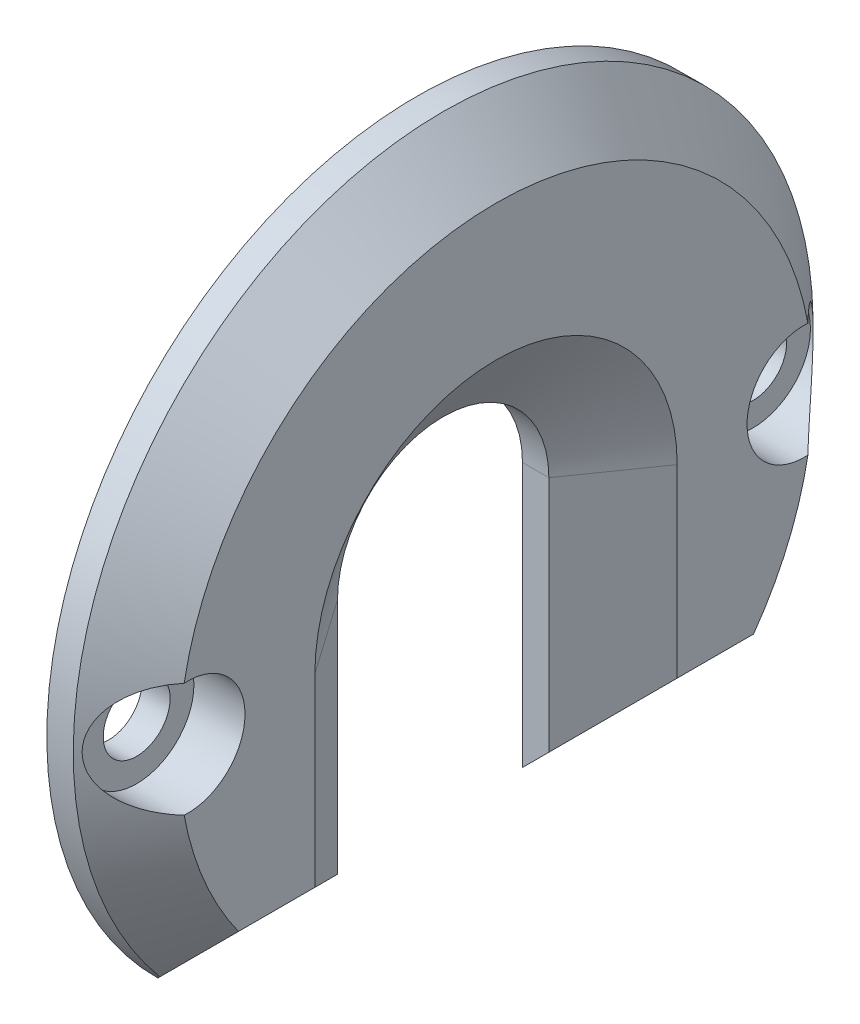
ISO-10303-21;
HEADER;
FILE_DESCRIPTION(('STEP AP214'),'2;1');
FILE_NAME('part.step','',(''),(''),'','','');
FILE_SCHEMA(('AUTOMOTIVE_DESIGN { 1 0 10303 214 1 1 1 1 }'));
ENDSEC;
DATA;
#1=APPLICATION_CONTEXT('core data for automotive mechanical design processes');
#2=APPLICATION_PROTOCOL_DEFINITION('international standard','automotive_design',2000,#1);
#3=PRODUCT_CONTEXT('',#1,'mechanical');
#4=PRODUCT('Part','Part','',(#3));
#5=PRODUCT_RELATED_PRODUCT_CATEGORY('part','',(#4));
#6=PRODUCT_DEFINITION_FORMATION('','',#4);
#7=PRODUCT_DEFINITION_CONTEXT('part definition',#1,'design');
#8=PRODUCT_DEFINITION('design','',#6,#7);
#9=PRODUCT_DEFINITION_SHAPE('','',#8);
#10=(LENGTH_UNIT() NAMED_UNIT(*) SI_UNIT(.MILLI.,.METRE.));
#11=(NAMED_UNIT(*) PLANE_ANGLE_UNIT() SI_UNIT($,.RADIAN.));
#12=(NAMED_UNIT(*) SI_UNIT($,.STERADIAN.) SOLID_ANGLE_UNIT());
#13=UNCERTAINTY_MEASURE_WITH_UNIT(LENGTH_MEASURE(1.E-05),#10,'distance_accuracy_value','');
#14=(GEOMETRIC_REPRESENTATION_CONTEXT(3) GLOBAL_UNCERTAINTY_ASSIGNED_CONTEXT((#13)) GLOBAL_UNIT_ASSIGNED_CONTEXT((#10,
#11,#12)) REPRESENTATION_CONTEXT('',''));
#15=CARTESIAN_POINT('',(0.,0.,0.));
#16=DIRECTION('',(0.,0.,1.));
#17=DIRECTION('',(1.,0.,0.));
#18=AXIS2_PLACEMENT_3D('',#15,#16,#17);
#19=CARTESIAN_POINT('',(4.50000000000082,-10.5000000000002,-21.0010000000009));
#20=DIRECTION('',(0.707106781186555,-0.70710678118655,0.));
#21=DIRECTION('',(0.707106781186547,0.707106781186553,0.));
#22=AXIS2_PLACEMENT_3D('',#19,#20,#21);
#23=PLANE('',#22);
#24=CARTESIAN_POINT('',(15.0000000000003,0.,-1.94289029309402E-13));
#25=DIRECTION('',(0.707106781186555,-0.70710678118655,0.));
#26=DIRECTION('',(-0.707106781186547,-0.707106781186553,0.));
#27=AXIS2_PLACEMENT_3D('',#24,#25,#26);
#28=ELLIPSE('',#27,29.698484809835,21.);
#29=CARTESIAN_POINT('',(1.50000000000047,-13.5000000000001,-16.0857079421456));
#30=VERTEX_POINT('',#29);
#31=CARTESIAN_POINT('',(3.05311331771918E-13,-15.0000000000002,-14.6969384566998));
#32=VERTEX_POINT('',#31);
#33=EDGE_CURVE('E151',#30,#32,#28,.F.);
#34=ORIENTED_EDGE('',*,*,#33,.F.);
#35=CARTESIAN_POINT('',(1.50000000000047,-13.5000000000001,-16.0857079421456));
#36=CARTESIAN_POINT('',(1.75120843427454,-13.2487915657263,-15.9685787376577));
#37=CARTESIAN_POINT('',(2.00214973383332,-12.9978502661677,-15.8503001173343));
#38=CARTESIAN_POINT('',(2.50343534547476,-12.4965646545263,-15.6113026354816));
#39=CARTESIAN_POINT('',(2.75377968918318,-12.2462203108179,-15.4905839065876));
#40=CARTESIAN_POINT('',(3.25383843695301,-11.746161563048,-15.2465509015868));
#41=CARTESIAN_POINT('',(3.5035528346431,-11.4964471653579,-15.1232365993451));
#42=CARTESIAN_POINT('',(4.00230337479783,-10.9976966252032,-14.87383515576));
#43=CARTESIAN_POINT('',(4.25133947974787,-10.7486605202531,-14.7477478644143));
#44=CARTESIAN_POINT('',(4.5000000000006,-10.5000000000002,-14.6201915172136));
#45=B_SPLINE_CURVE_WITH_KNOTS('',3,(#35,#36,#37,#38,#39,#40,#41,#42,#43,#44),.UNSPECIFIED.,.F.,
.F.,(4,2,2,2,4),(0.,1.12221862532232,2.24437641415397,3.36654550744811,4.48877545348732),.UNSPECIFIED.);
#46=CARTESIAN_POINT('',(4.5000000000006,-10.5000000000002,-14.6201915172136));
#47=VERTEX_POINT('',#46);
#48=EDGE_CURVE('E11',#30,#47,#45,.T.);
#49=ORIENTED_EDGE('',*,*,#48,.T.);
#50=DIRECTION('',(0.,0.,-1.00000000000001));
#51=VECTOR('',#50,1.);
#52=CARTESIAN_POINT('',(4.50000000000018,-10.5000000000003,-6.00000000000067));
#53=LINE('',#52,#51);
#54=CARTESIAN_POINT('',(4.50000000000045,-10.5000000000003,-10.2844440202272));
#55=VERTEX_POINT('',#54);
#56=EDGE_CURVE('E144',#55,#47,#53,.T.);
#57=ORIENTED_EDGE('',*,*,#56,.F.);
#58=DIRECTION('',(0.49754281216453,0.497542812164528,-0.710564775461635));
#59=VECTOR('',#58,1.);
#60=CARTESIAN_POINT('',(8.28869258514041,-6.71130741486042,-15.6952577838517));
#61=LINE('',#60,#59);
#62=CARTESIAN_POINT('',(1.50000000000057,-13.5000000000003,-6.00000000000067));
#63=VERTEX_POINT('',#62);
#64=EDGE_CURVE('E186',#55,#63,#61,.F.);
#65=ORIENTED_EDGE('',*,*,#64,.T.);
#66=DIRECTION('',(-0.707106781186547,-0.707106781186553,0.));
#67=VECTOR('',#66,1.);
#68=CARTESIAN_POINT('',(4.50000000000018,-10.5000000000003,-6.00000000000067));
#69=LINE('',#68,#67);
#70=CARTESIAN_POINT('',(3.33066907387547E-13,-15.0000000000003,-6.00000000000059));
#71=VERTEX_POINT('',#70);
#72=EDGE_CURVE('E131',#63,#71,#69,.T.);
#73=ORIENTED_EDGE('',*,*,#72,.T.);
#74=DIRECTION('',(0.,0.,1.00000000000001));
#75=VECTOR('',#74,1.);
#76=CARTESIAN_POINT('',(6.80011602582908E-13,-15.0000000000003,-21.0010000000004));
#77=LINE('',#76,#75);
#78=EDGE_CURVE('E149',#32,#71,#77,.T.);
#79=ORIENTED_EDGE('',*,*,#78,.F.);
#80=EDGE_LOOP('',(#34,#49,#57,#65,#73,#79));
#81=FACE_BOUND('',#80,.T.);
#82=ADVANCED_FACE('F32',(#81),#23,.T.);
#83=CARTESIAN_POINT('',(4.50000000000003,-1.38777878078145E-13,4.44089209850063E-13));
#84=DIRECTION('',(-1.00000000000001,0.,0.));
#85=DIRECTION('',(0.,0.,1.00000000000001));
#86=AXIS2_PLACEMENT_3D('',#83,#84,#85);
#87=CYLINDRICAL_SURFACE('',#86,6.);
#88=DIRECTION('',(-1.00000000000001,0.,0.));
#89=VECTOR('',#88,1.);
#90=CARTESIAN_POINT('',(4.50000000000025,-2.22044604925031E-13,-5.99999999999964));
#91=LINE('',#90,#89);
#92=CARTESIAN_POINT('',(1.50000000000028,0.,-5.99999999999992));
#93=VERTEX_POINT('',#92);
#94=CARTESIAN_POINT('',(3.7470027081099E-13,0.,-5.99999999999998));
#95=VERTEX_POINT('',#94);
#96=EDGE_CURVE('E166',#93,#95,#91,.T.);
#97=ORIENTED_EDGE('',*,*,#96,.F.);
#98=CARTESIAN_POINT('',(1.5,0.,1.11022302462516E-13));
#99=DIRECTION('',(-1.00000000000001,0.,0.));
#100=DIRECTION('',(0.,0.,1.00000000000001));
#101=AXIS2_PLACEMENT_3D('',#98,#99,#100);
#102=CIRCLE('',#101,6.);
#103=CARTESIAN_POINT('',(1.50000000000008,-1.38777878078145E-13,5.99999999999998));
#104=VERTEX_POINT('',#103);
#105=EDGE_CURVE('E190',#93,#104,#102,.F.);
#106=ORIENTED_EDGE('',*,*,#105,.T.);
#107=DIRECTION('',(-1.00000000000001,0.,0.));
#108=VECTOR('',#107,1.);
#109=CARTESIAN_POINT('',(4.5000000000001,-2.22044604925031E-13,6.00000000000014));
#110=LINE('',#109,#108);
#111=CARTESIAN_POINT('',(0.,-3.88578058618805E-13,5.99999999999978));
#112=VERTEX_POINT('',#111);
#113=EDGE_CURVE('E159',#104,#112,#110,.T.);
#114=ORIENTED_EDGE('',*,*,#113,.T.);
#115=CARTESIAN_POINT('',(0.,0.,0.));
#116=DIRECTION('',(-1.00000000000001,0.,0.));
#117=DIRECTION('',(0.,0.,1.00000000000001));
#118=AXIS2_PLACEMENT_3D('',#115,#116,#117);
#119=CIRCLE('',#118,6.);
#120=EDGE_CURVE('E143',#112,#95,#119,.T.);
#121=ORIENTED_EDGE('',*,*,#120,.T.);
#122=EDGE_LOOP('',(#97,#106,#114,#121));
#123=FACE_BOUND('',#122,.T.);
#124=ADVANCED_FACE('F275',(#123),#87,.F.);
#125=CARTESIAN_POINT('',(4.50000000000018,-10.5000000000003,-6.00000000000067));
#126=DIRECTION('',(0.,0.,-1.00000000000001));
#127=DIRECTION('',(-1.00000000000001,0.,0.));
#128=AXIS2_PLACEMENT_3D('',#125,#126,#127);
#129=PLANE('',#128);
#130=ORIENTED_EDGE('',*,*,#72,.F.);
#131=DIRECTION('',(0.,1.,0.));
#132=VECTOR('',#131,1.);
#133=CARTESIAN_POINT('',(1.50000000000033,-10.5000000000004,-6.00000000000042));
#134=LINE('',#133,#132);
#135=EDGE_CURVE('E188',#63,#93,#134,.T.);
#136=ORIENTED_EDGE('',*,*,#135,.T.);
#137=ORIENTED_EDGE('',*,*,#96,.T.);
#138=DIRECTION('',(0.,-1.,0.));
#139=VECTOR('',#138,1.);
#140=CARTESIAN_POINT('',(4.44089209850063E-13,-10.5000000000004,-6.00000000000084));
#141=LINE('',#140,#139);
#142=EDGE_CURVE('E161',#95,#71,#141,.T.);
#143=ORIENTED_EDGE('',*,*,#142,.T.);
#144=EDGE_LOOP('',(#130,#136,#137,#143));
#145=FACE_BOUND('',#144,.T.);
#146=ADVANCED_FACE('F291',(#145),#129,.F.);
#147=CARTESIAN_POINT('',(4.50000000000003,-1.38777878078145E-13,4.44089209850063E-13));
#148=DIRECTION('',(-1.00000000000001,0.,0.));
#149=DIRECTION('',(0.,0.,1.00000000000001));
#150=AXIS2_PLACEMENT_3D('',#147,#148,#149);
#151=CYLINDRICAL_SURFACE('',#150,21.);
#152=CARTESIAN_POINT('',(15.0000000000003,0.,-1.94289029309402E-13));
#153=DIRECTION('',(-0.707106781186555,0.70710678118655,0.));
#154=DIRECTION('',(-0.707106781186547,-0.707106781186553,0.));
#155=AXIS2_PLACEMENT_3D('',#152,#153,#154);
#156=ELLIPSE('',#155,29.698484809835,21.);
#157=CARTESIAN_POINT('',(1.50000000000015,-13.5000000000001,16.0857079421449));
#158=VERTEX_POINT('',#157);
#159=CARTESIAN_POINT('',(1.66533453693773E-13,-15.0000000000002,14.6969384566991));
#160=VERTEX_POINT('',#159);
#161=EDGE_CURVE('E148',#158,#160,#156,.F.);
#162=ORIENTED_EDGE('',*,*,#161,.F.);
#163=CARTESIAN_POINT('',(1.5,0.,1.11022302462516E-13));
#164=DIRECTION('',(-1.00000000000001,0.,0.));
#165=DIRECTION('',(0.,0.,1.00000000000001));
#166=AXIS2_PLACEMENT_3D('',#163,#164,#165);
#167=CIRCLE('',#166,21.);
#168=EDGE_CURVE('E46',#158,#30,#167,.T.);
#169=ORIENTED_EDGE('',*,*,#168,.T.);
#170=ORIENTED_EDGE('',*,*,#33,.T.);
#171=CARTESIAN_POINT('',(0.,0.,0.));
#172=DIRECTION('',(1.00000000000001,0.,0.));
#173=DIRECTION('',(0.,0.,-1.00000000000001));
#174=AXIS2_PLACEMENT_3D('',#171,#172,#173);
#175=CIRCLE('',#174,21.);
#176=EDGE_CURVE('E145',#32,#160,#175,.T.);
#177=ORIENTED_EDGE('',*,*,#176,.T.);
#178=EDGE_LOOP('',(#162,#169,#170,#177));
#179=FACE_BOUND('',#178,.T.);
#180=ADVANCED_FACE('F295',(#179),#151,.T.);
#181=CARTESIAN_POINT('',(4.50000000000064,-10.5000000000003,5.99999999999967));
#182=DIRECTION('',(0.,0.,1.00000000000001));
#183=DIRECTION('',(1.00000000000001,0.,0.));
#184=AXIS2_PLACEMENT_3D('',#181,#182,#183);
#185=PLANE('',#184);
#186=ORIENTED_EDGE('',*,*,#113,.F.);
#187=DIRECTION('',(0.,-1.,0.));
#188=VECTOR('',#187,1.);
#189=CARTESIAN_POINT('',(1.50000000000061,-10.5000000000002,5.99999999999973));
#190=LINE('',#189,#188);
#191=CARTESIAN_POINT('',(1.50000000000035,-13.5000000000004,5.99999999999962));
#192=VERTEX_POINT('',#191);
#193=EDGE_CURVE('E127',#104,#192,#190,.T.);
#194=ORIENTED_EDGE('',*,*,#193,.T.);
#195=DIRECTION('',(-0.707106781186547,-0.707106781186553,0.));
#196=VECTOR('',#195,1.);
#197=CARTESIAN_POINT('',(4.50000000000064,-10.5000000000003,5.99999999999967));
#198=LINE('',#197,#196);
#199=CARTESIAN_POINT('',(2.35922392732846E-13,-15.0000000000003,5.9999999999997));
#200=VERTEX_POINT('',#199);
#201=EDGE_CURVE('E120',#192,#200,#198,.T.);
#202=ORIENTED_EDGE('',*,*,#201,.T.);
#203=DIRECTION('',(0.,1.,0.));
#204=VECTOR('',#203,1.);
#205=CARTESIAN_POINT('',(5.96744875736022E-13,-10.5000000000001,6.00000000000003));
#206=LINE('',#205,#204);
#207=EDGE_CURVE('E124',#200,#112,#206,.T.);
#208=ORIENTED_EDGE('',*,*,#207,.T.);
#209=EDGE_LOOP('',(#186,#194,#202,#208));
#210=FACE_BOUND('',#209,.T.);
#211=ADVANCED_FACE('F123',(#210),#185,.F.);
#212=CARTESIAN_POINT('',(4.50000000000003,-1.38777878078145E-13,4.44089209850063E-13));
#213=DIRECTION('',(-1.00000000000001,0.,0.));
#214=DIRECTION('',(0.,0.,1.00000000000001));
#215=AXIS2_PLACEMENT_3D('',#212,#213,#214);
#216=PLANE('',#215);
#217=ORIENTED_EDGE('',*,*,#56,.T.);
#218=CARTESIAN_POINT('',(4.50000000000003,-1.38777878078145E-13,4.44089209850063E-13));
#219=DIRECTION('',(-1.00000000000001,0.,0.));
#220=DIRECTION('',(0.,0.,1.00000000000001));
#221=AXIS2_PLACEMENT_3D('',#218,#219,#220);
#222=CIRCLE('',#221,18.);
#223=CARTESIAN_POINT('',(4.50000000000002,-3.24350557944336,-17.7053571428577));
#224=VERTEX_POINT('',#223);
#225=EDGE_CURVE('E202',#47,#224,#222,.F.);
#226=ORIENTED_EDGE('',*,*,#225,.T.);
#227=CARTESIAN_POINT('',(4.50000000000006,-2.4980018054066E-13,-17.5000000000003));
#228=DIRECTION('',(1.00000000000001,0.,0.));
#229=DIRECTION('',(0.,0.,-1.00000000000001));
#230=AXIS2_PLACEMENT_3D('',#227,#228,#229);
#231=CIRCLE('',#230,3.25);
#232=CARTESIAN_POINT('',(4.5000000000003,3.24350557944278,-17.7053571428576));
#233=VERTEX_POINT('',#232);
#234=EDGE_CURVE('E175',#233,#224,#231,.T.);
#235=ORIENTED_EDGE('',*,*,#234,.F.);
#236=CARTESIAN_POINT('',(4.50000000000003,-1.38777878078145E-13,4.44089209850063E-13));
#237=DIRECTION('',(-1.00000000000001,0.,0.));
#238=DIRECTION('',(0.,0.,1.00000000000001));
#239=AXIS2_PLACEMENT_3D('',#236,#237,#238);
#240=CIRCLE('',#239,18.);
#241=CARTESIAN_POINT('',(4.5000000000003,3.24350557944264,17.7053571428576));
#242=VERTEX_POINT('',#241);
#243=EDGE_CURVE('E200',#233,#242,#240,.F.);
#244=ORIENTED_EDGE('',*,*,#243,.T.);
#245=CARTESIAN_POINT('',(4.50000000000014,-4.44089209850063E-13,17.5000000000001));
#246=DIRECTION('',(1.00000000000001,0.,0.));
#247=DIRECTION('',(0.,0.,-1.00000000000001));
#248=AXIS2_PLACEMENT_3D('',#245,#246,#247);
#249=CIRCLE('',#248,3.25);
#250=CARTESIAN_POINT('',(4.50000000000014,-3.24350557944314,17.7053571428568));
#251=VERTEX_POINT('',#250);
#252=EDGE_CURVE('E198',#251,#242,#249,.T.);
#253=ORIENTED_EDGE('',*,*,#252,.F.);
#254=CARTESIAN_POINT('',(4.50000000000003,-1.38777878078145E-13,4.44089209850063E-13));
#255=DIRECTION('',(-1.00000000000001,0.,0.));
#256=DIRECTION('',(0.,0.,1.00000000000001));
#257=AXIS2_PLACEMENT_3D('',#254,#255,#256);
#258=CIRCLE('',#257,18.);
#259=CARTESIAN_POINT('',(4.50000000000061,-10.5000000000003,14.6201915172132));
#260=VERTEX_POINT('',#259);
#261=EDGE_CURVE('E192',#251,#260,#258,.F.);
#262=ORIENTED_EDGE('',*,*,#261,.T.);
#263=DIRECTION('',(0.,0.,-1.00000000000001));
#264=VECTOR('',#263,1.);
#265=CARTESIAN_POINT('',(4.50000000000064,-10.5000000000003,5.99999999999967));
#266=LINE('',#265,#264);
#267=CARTESIAN_POINT('',(4.50000000000071,-10.5000000000003,10.284444020226));
#268=VERTEX_POINT('',#267);
#269=EDGE_CURVE('E157',#260,#268,#266,.T.);
#270=ORIENTED_EDGE('',*,*,#269,.T.);
#271=DIRECTION('',(0.,1.,0.));
#272=VECTOR('',#271,1.);
#273=CARTESIAN_POINT('',(4.5000000000002,-3.88578058618805E-13,10.2844440202267));
#274=LINE('',#273,#272);
#275=CARTESIAN_POINT('',(4.5000000000002,-3.88578058618805E-13,10.2844440202267));
#276=VERTEX_POINT('',#275);
#277=EDGE_CURVE('E180',#268,#276,#274,.T.);
#278=ORIENTED_EDGE('',*,*,#277,.T.);
#279=CARTESIAN_POINT('',(4.50000000000003,-1.38777878078145E-13,4.44089209850063E-13));
#280=DIRECTION('',(-1.00000000000001,0.,0.));
#281=DIRECTION('',(0.,0.,1.00000000000001));
#282=AXIS2_PLACEMENT_3D('',#279,#280,#281);
#283=CIRCLE('',#282,10.2844440202263);
#284=CARTESIAN_POINT('',(4.5000000000003,-4.44089209850063E-13,-10.2844440202263));
#285=VERTEX_POINT('',#284);
#286=EDGE_CURVE('E168',#276,#285,#283,.T.);
#287=ORIENTED_EDGE('',*,*,#286,.T.);
#288=DIRECTION('',(0.,-1.,0.));
#289=VECTOR('',#288,1.);
#290=CARTESIAN_POINT('',(4.5000000000003,-4.44089209850063E-13,-10.2844440202263));
#291=LINE('',#290,#289);
#292=EDGE_CURVE('E178',#285,#55,#291,.T.);
#293=ORIENTED_EDGE('',*,*,#292,.T.);
#294=EDGE_LOOP('',(#217,#226,#235,#244,#253,#262,#270,#278,#287,#293));
#295=FACE_BOUND('',#294,.T.);
#296=ADVANCED_FACE('F237',(#295),#216,.F.);
#297=CARTESIAN_POINT('',(0.,0.,0.));
#298=DIRECTION('',(-1.00000000000001,0.,0.));
#299=DIRECTION('',(0.,0.,1.00000000000001));
#300=AXIS2_PLACEMENT_3D('',#297,#298,#299);
#301=PLANE('',#300);
#302=CARTESIAN_POINT('',(2.08166817117217E-13,-3.05311331771918E-13,17.4999999999999));
#303=DIRECTION('',(-1.00000000000001,0.,0.));
#304=DIRECTION('',(0.,0.,1.00000000000001));
#305=AXIS2_PLACEMENT_3D('',#302,#303,#304);
#306=CIRCLE('',#305,1.9);
#307=CARTESIAN_POINT('',(2.08166817117217E-13,-3.05311331771919E-13,19.4));
#308=VERTEX_POINT('',#307);
#309=EDGE_CURVE('E172',#308,#308,#306,.T.);
#310=ORIENTED_EDGE('',*,*,#309,.F.);
#311=EDGE_LOOP('',(#310));
#312=FACE_BOUND('',#311,.T.);
#313=CARTESIAN_POINT('',(0.,0.,-17.5000000000008));
#314=DIRECTION('',(-1.00000000000001,0.,0.));
#315=DIRECTION('',(0.,0.,1.00000000000001));
#316=AXIS2_PLACEMENT_3D('',#313,#314,#315);
#317=CIRCLE('',#316,1.9);
#318=CARTESIAN_POINT('',(0.,0.,-15.6000000000008));
#319=VERTEX_POINT('',#318);
#320=EDGE_CURVE('E132',#319,#319,#317,.T.);
#321=ORIENTED_EDGE('',*,*,#320,.F.);
#322=EDGE_LOOP('',(#321));
#323=FACE_BOUND('',#322,.T.);
#324=ORIENTED_EDGE('',*,*,#78,.T.);
#325=ORIENTED_EDGE('',*,*,#142,.F.);
#326=ORIENTED_EDGE('',*,*,#120,.F.);
#327=ORIENTED_EDGE('',*,*,#207,.F.);
#328=EDGE_CURVE('E139',#200,#160,#77,.T.);
#329=ORIENTED_EDGE('',*,*,#328,.T.);
#330=ORIENTED_EDGE('',*,*,#176,.F.);
#331=EDGE_LOOP('',(#324,#325,#326,#327,#329,#330));
#332=FACE_BOUND('',#331,.T.);
#333=ADVANCED_FACE('F137',(#312,#323,#332),#301,.T.);
#334=ORIENTED_EDGE('',*,*,#269,.F.);
#335=CARTESIAN_POINT('',(4.50000000000061,-10.5000000000003,14.6201915172132));
#336=CARTESIAN_POINT('',(4.25133947974805,-10.7486605202529,14.7477478644147));
#337=CARTESIAN_POINT('',(4.00230337479807,-10.997696625203,14.8738351557607));
#338=CARTESIAN_POINT('',(3.50355283464336,-11.4964471653577,15.123236599346));
#339=CARTESIAN_POINT('',(3.25383843695324,-11.7461615630478,15.2465509015876));
#340=CARTESIAN_POINT('',(2.7537796891834,-12.2462203108176,15.4905839065884));
#341=CARTESIAN_POINT('',(2.50343534547502,-12.4965646545261,15.6113026354825));
#342=CARTESIAN_POINT('',(2.00214973383347,-12.9978502661675,15.8503001173349));
#343=CARTESIAN_POINT('',(1.75120843427455,-13.2487915657262,15.968578737658));
#344=CARTESIAN_POINT('',(1.50000000000015,-13.5000000000001,16.0857079421449));
#345=B_SPLINE_CURVE_WITH_KNOTS('',3,(#335,#336,#337,#338,#339,#340,#341,#342,#343,#344),
.UNSPECIFIED.,.F.,.F.,(4,2,2,2,4),(0.,1.12222994603926,2.24439903933343,3.36655682816512,
4.48877545348749),.UNSPECIFIED.);
#346=EDGE_CURVE('E60',#260,#158,#345,.T.);
#347=ORIENTED_EDGE('',*,*,#346,.T.);
#348=ORIENTED_EDGE('',*,*,#161,.T.);
#349=ORIENTED_EDGE('',*,*,#328,.F.);
#350=ORIENTED_EDGE('',*,*,#201,.F.);
#351=DIRECTION('',(-0.497542812164526,-0.497542812164527,-0.710564775461635));
#352=VECTOR('',#351,1.);
#353=CARTESIAN_POINT('',(-6.56054314519912,-21.5605431451998,-5.51164862607564));
#354=LINE('',#353,#352);
#355=EDGE_CURVE('E184',#192,#268,#354,.F.);
#356=ORIENTED_EDGE('',*,*,#355,.T.);
#357=EDGE_LOOP('',(#334,#347,#348,#349,#350,#356));
#358=FACE_BOUND('',#357,.T.);
#359=ADVANCED_FACE('F147',(#358),#23,.T.);
#360=CARTESIAN_POINT('',(4.50000000000006,-2.4980018054066E-13,-17.5000000000003));
#361=DIRECTION('',(1.00000000000001,0.,0.));
#362=DIRECTION('',(0.,0.,-1.00000000000001));
#363=AXIS2_PLACEMENT_3D('',#360,#361,#362);
#364=CYLINDRICAL_SURFACE('',#363,1.9);
#365=ORIENTED_EDGE('',*,*,#320,.T.);
#366=EDGE_LOOP('',(#365));
#367=FACE_BOUND('',#366,.T.);
#368=CARTESIAN_POINT('',(1.60000000000006,-1.38777878078145E-13,-17.5000000000005));
#369=DIRECTION('',(1.00000000000001,0.,0.));
#370=DIRECTION('',(0.,0.,-1.00000000000001));
#371=AXIS2_PLACEMENT_3D('',#368,#369,#370);
#372=CIRCLE('',#371,1.9);
#373=CARTESIAN_POINT('',(1.60000000000006,-1.38777878078144E-13,-19.4000000000006));
#374=VERTEX_POINT('',#373);
#375=EDGE_CURVE('E171',#374,#374,#372,.T.);
#376=ORIENTED_EDGE('',*,*,#375,.T.);
#377=EDGE_LOOP('',(#376));
#378=FACE_BOUND('',#377,.T.);
#379=ADVANCED_FACE('F230',(#367,#378),#364,.F.);
#380=CARTESIAN_POINT('',(1.60000000000038,1.89999999999979,-17.5000000000001));
#381=DIRECTION('',(-1.00000000000001,0.,0.));
#382=DIRECTION('',(0.,0.,1.00000000000001));
#383=AXIS2_PLACEMENT_3D('',#380,#381,#382);
#384=PLANE('',#383);
#385=ORIENTED_EDGE('',*,*,#375,.F.);
#386=EDGE_LOOP('',(#385));
#387=FACE_BOUND('',#386,.T.);
#388=CARTESIAN_POINT('',(1.60000000000006,-1.38777878078145E-13,-17.5000000000005));
#389=DIRECTION('',(1.00000000000001,0.,0.));
#390=DIRECTION('',(0.,0.,-1.00000000000001));
#391=AXIS2_PLACEMENT_3D('',#388,#389,#390);
#392=CIRCLE('',#391,3.25);
#393=CARTESIAN_POINT('',(1.60000000000006,-1.38777878078144E-13,-20.7500000000006));
#394=VERTEX_POINT('',#393);
#395=EDGE_CURVE('E313',#394,#394,#392,.T.);
#396=ORIENTED_EDGE('',*,*,#395,.T.);
#397=EDGE_LOOP('',(#396));
#398=FACE_BOUND('',#397,.T.);
#399=ADVANCED_FACE('F225',(#387,#398),#384,.F.);
#400=CARTESIAN_POINT('',(4.50000000000006,-2.4980018054066E-13,-17.5000000000003));
#401=DIRECTION('',(1.00000000000001,0.,0.));
#402=DIRECTION('',(0.,0.,-1.00000000000001));
#403=AXIS2_PLACEMENT_3D('',#400,#401,#402);
#404=CYLINDRICAL_SURFACE('',#403,3.25);
#405=ORIENTED_EDGE('',*,*,#395,.F.);
#406=EDGE_LOOP('',(#405));
#407=FACE_BOUND('',#406,.T.);
#408=ORIENTED_EDGE('',*,*,#234,.T.);
#409=CARTESIAN_POINT('',(4.50000000000002,-3.24350557944336,-17.7053571428577));
#410=CARTESIAN_POINT('',(4.40491325691544,-3.23730265626631,-17.8031559713492));
#411=CARTESIAN_POINT('',(4.3103423285214,-3.22666302012878,-17.9012085410111));
#412=CARTESIAN_POINT('',(4.12258575925513,-3.19617387637413,-18.097373577761));
#413=CARTESIAN_POINT('',(4.02940144455375,-3.17631607189195,-18.1954860191232));
#414=CARTESIAN_POINT('',(3.84416360627817,-3.1268555623821,-18.3919735712668));
#415=CARTESIAN_POINT('',(3.75212634750182,-3.09717173616846,-18.4903438672171));
#416=CARTESIAN_POINT('',(3.57058457862148,-3.02773803076688,-18.685772018013));
#417=CARTESIAN_POINT('',(3.48107920552932,-2.98799162849104,-18.7828303140151));
#418=CARTESIAN_POINT('',(3.2417366397736,-2.86555516468406,-19.0441536394129));
#419=CARTESIAN_POINT('',(3.09486442640819,-2.77255110071897,-19.2064879410133));
#420=CARTESIAN_POINT('',(2.81461958093182,-2.55352537724708,-19.5194897775674));
#421=CARTESIAN_POINT('',(2.68120679871264,-2.42760620003097,-19.6701916762863));
#422=CARTESIAN_POINT('',(2.46001951020875,-2.17254379144847,-19.9222530429852));
#423=CARTESIAN_POINT('',(2.36863948431774,-2.0501029329575,-20.0272028754959));
#424=CARTESIAN_POINT('',(2.20055754701829,-1.78428408218171,-20.2213661063258));
#425=CARTESIAN_POINT('',(2.12384286084602,-1.64092450563811,-20.3105931951472));
#426=CARTESIAN_POINT('',(2.00035098571445,-1.36081368894637,-20.4548555071487));
#427=CARTESIAN_POINT('',(1.9507097010556,-1.22699634861796,-20.5131164073272));
#428=CARTESIAN_POINT('',(1.86664582943489,-0.948455112608677,-20.6120293857292));
#429=CARTESIAN_POINT('',(1.83221499344663,-0.803737178577839,-20.6526910082608));
#430=CARTESIAN_POINT('',(1.78043018265515,-0.506300093665162,-20.7139252652843));
#431=CARTESIAN_POINT('',(1.76316333970617,-0.353544221440356,-20.7343953950218));
#432=CARTESIAN_POINT('',(1.74718925211867,-0.0457141839204143,-20.7533309201614));
#433=CARTESIAN_POINT('',(1.74847656928351,0.109359288778079,-20.7518027632288));
#434=CARTESIAN_POINT('',(1.76858025420827,0.403112070686662,-20.7279768184699));
#435=CARTESIAN_POINT('',(1.78587292494995,0.542050465983998,-20.7074844334987));
#436=CARTESIAN_POINT('',(1.83486624441058,0.81366517644709,-20.6495616649789));
#437=CARTESIAN_POINT('',(1.86656757780525,0.946341193704296,-20.612130476527));
#438=CARTESIAN_POINT('',(1.94408485578425,1.20677731633818,-20.5209031265491));
#439=CARTESIAN_POINT('',(1.99032971867518,1.33423336850405,-20.4666103891889));
#440=CARTESIAN_POINT('',(2.09454659925194,1.57742229124483,-20.3447802667751));
#441=CARTESIAN_POINT('',(2.15252475606707,1.69314897697458,-20.2772359487574));
#442=CARTESIAN_POINT('',(2.3048171744176,1.95797621978557,-20.1007133415887));
#443=CARTESIAN_POINT('',(2.40414450601979,2.10057301862096,-19.9862732665723));
#444=CARTESIAN_POINT('',(2.61771455797323,2.35928975441774,-19.7423231981613));
#445=CARTESIAN_POINT('',(2.73198703126772,2.47535557192594,-19.6127832011519));
#446=CARTESIAN_POINT('',(3.0096393953816,2.7145183717425,-19.3010524251536));
#447=CARTESIAN_POINT('',(3.17708115997085,2.82811820544785,-19.1152165280211));
#448=CARTESIAN_POINT('',(3.52462525238738,3.01369174713295,-18.7349162088778));
#449=CARTESIAN_POINT('',(3.70474090821722,3.08562087731254,-18.540442785238));
#450=CARTESIAN_POINT('',(3.98889881563514,3.16696536669039,-18.2382367690033));
#451=CARTESIAN_POINT('',(4.09021310744296,3.18993156737557,-18.1313523220734));
#452=CARTESIAN_POINT('',(4.29414412492163,3.2248046942224,-17.9180090402266));
#453=CARTESIAN_POINT('',(4.39675225189372,3.23676423641642,-17.8115506283534));
#454=CARTESIAN_POINT('',(4.5000000000003,3.24350557944278,-17.7053571428576));
#455=B_SPLINE_CURVE_WITH_KNOTS('',3,(#409,#410,#411,#412,#413,#414,#415,#416,#417,#418,#419,
#420,#421,#422,#423,#424,#425,#426,#427,#428,#429,#430,#431,#432,#433,#434,#435,#436,#437,#438,
#439,#440,#441,#442,#443,#444,#445,#446,#447,#448,#449,#450,#451,#452,#453,#454),.UNSPECIFIED.,
.F.,.F.,(4,2,2,2,2,2,2,2,2,2,2,2,2,2,2,2,2,2,2,2,2,2,4),(0.,0.409596084041382,0.819561544307734,
1.23299969504019,1.64629518539791,2.35718937360715,3.06589600085896,3.6199175778025,
4.17345433333916,4.63402462660363,5.09434483292496,5.5569900692733,6.01949970775136,
6.44205952743076,6.86463942855071,7.30108221950779,7.7377539605318,8.35855481088906,
8.98061092592969,9.80044380499534,10.6211520995914,11.0679442866099,11.5125893707698),.UNSPECIFIED.);
#456=EDGE_CURVE('E205',#224,#233,#455,.T.);
#457=ORIENTED_EDGE('',*,*,#456,.T.);
#458=EDGE_LOOP('',(#408,#457));
#459=FACE_BOUND('',#458,.T.);
#460=ADVANCED_FACE('F219',(#407,#459),#404,.F.);
#461=CARTESIAN_POINT('',(4.50000000000014,-4.44089209850063E-13,17.5000000000001));
#462=DIRECTION('',(1.00000000000001,0.,0.));
#463=DIRECTION('',(0.,0.,-1.00000000000001));
#464=AXIS2_PLACEMENT_3D('',#461,#462,#463);
#465=CYLINDRICAL_SURFACE('',#464,1.9);
#466=ORIENTED_EDGE('',*,*,#309,.T.);
#467=EDGE_LOOP('',(#466));
#468=FACE_BOUND('',#467,.T.);
#469=CARTESIAN_POINT('',(1.60000000000014,-4.44089209850063E-13,17.4999999999997));
#470=DIRECTION('',(1.00000000000001,0.,0.));
#471=DIRECTION('',(0.,0.,-1.00000000000001));
#472=AXIS2_PLACEMENT_3D('',#469,#470,#471);
#473=CIRCLE('',#472,1.9);
#474=CARTESIAN_POINT('',(1.60000000000014,-4.44089209850062E-13,15.5999999999997));
#475=VERTEX_POINT('',#474);
#476=EDGE_CURVE('E176',#475,#475,#473,.T.);
#477=ORIENTED_EDGE('',*,*,#476,.T.);
#478=EDGE_LOOP('',(#477));
#479=FACE_BOUND('',#478,.T.);
#480=ADVANCED_FACE('F224',(#468,#479),#465,.F.);
#481=CARTESIAN_POINT('',(1.6,1.89999999999979,17.5000000000002));
#482=DIRECTION('',(-1.00000000000001,0.,0.));
#483=DIRECTION('',(0.,0.,1.00000000000001));
#484=AXIS2_PLACEMENT_3D('',#481,#482,#483);
#485=PLANE('',#484);
#486=ORIENTED_EDGE('',*,*,#476,.F.);
#487=EDGE_LOOP('',(#486));
#488=FACE_BOUND('',#487,.T.);
#489=CARTESIAN_POINT('',(1.60000000000014,-4.44089209850063E-13,17.4999999999997));
#490=DIRECTION('',(1.00000000000001,0.,0.));
#491=DIRECTION('',(0.,0.,-1.00000000000001));
#492=AXIS2_PLACEMENT_3D('',#489,#490,#491);
#493=CIRCLE('',#492,3.25);
#494=CARTESIAN_POINT('',(1.60000000000014,-4.44089209850062E-13,14.2499999999997));
#495=VERTEX_POINT('',#494);
#496=EDGE_CURVE('E254',#495,#495,#493,.T.);
#497=ORIENTED_EDGE('',*,*,#496,.T.);
#498=EDGE_LOOP('',(#497));
#499=FACE_BOUND('',#498,.T.);
#500=ADVANCED_FACE('F326',(#488,#499),#485,.F.);
#501=CARTESIAN_POINT('',(4.50000000000014,-4.44089209850063E-13,17.5000000000001));
#502=DIRECTION('',(1.00000000000001,0.,0.));
#503=DIRECTION('',(0.,0.,-1.00000000000001));
#504=AXIS2_PLACEMENT_3D('',#501,#502,#503);
#505=CYLINDRICAL_SURFACE('',#504,3.25);
#506=ORIENTED_EDGE('',*,*,#496,.F.);
#507=EDGE_LOOP('',(#506));
#508=FACE_BOUND('',#507,.T.);
#509=ORIENTED_EDGE('',*,*,#252,.T.);
#510=CARTESIAN_POINT('',(4.5000000000003,3.24350557944264,17.7053571428576));
#511=CARTESIAN_POINT('',(4.40491325691607,3.23730265626556,17.8031559713495));
#512=CARTESIAN_POINT('',(4.31034232852212,3.22666302012802,17.9012085410113));
#513=CARTESIAN_POINT('',(4.12258575925588,3.19617387637336,18.0973735777612));
#514=CARTESIAN_POINT('',(4.02940144455445,3.17631607189118,18.1954860191233));
#515=CARTESIAN_POINT('',(3.84416360627908,3.1268555623813,18.391973571267));
#516=CARTESIAN_POINT('',(3.75212634750301,3.09717173616765,18.4903438672175));
#517=CARTESIAN_POINT('',(3.57058457862217,3.02773803076615,18.6857720180127));
#518=CARTESIAN_POINT('',(3.48107920552923,2.98799162849041,18.782830314014));
#519=CARTESIAN_POINT('',(3.24173663977302,2.8655551646835,19.0441536394113));
#520=CARTESIAN_POINT('',(3.09486442640912,2.77255110071824,19.2064879410129));
#521=CARTESIAN_POINT('',(2.81461958093315,2.55352537724643,19.5194897775674));
#522=CARTESIAN_POINT('',(2.68120679871288,2.42760620003056,19.6701916762857));
#523=CARTESIAN_POINT('',(2.46001951020905,2.17254379144785,19.9222530429845));
#524=CARTESIAN_POINT('',(2.36863948431876,2.05010293295656,20.0272028754956));
#525=CARTESIAN_POINT('',(2.20055754701928,1.78428408218091,20.221366106326));
#526=CARTESIAN_POINT('',(2.12384286084627,1.64092450563777,20.3105931951477));
#527=CARTESIAN_POINT('',(2.00035098571488,1.36081368894599,20.454855507149));
#528=CARTESIAN_POINT('',(1.9507097010567,1.22699634861727,20.5131164073272));
#529=CARTESIAN_POINT('',(1.86664582943598,0.948455112607932,20.6120293857289));
#530=CARTESIAN_POINT('',(1.83221499344704,0.803737178577365,20.6526910082607));
#531=CARTESIAN_POINT('',(1.78043018265561,0.506300093664851,20.7139252652842));
#532=CARTESIAN_POINT('',(1.76316333970737,0.353544221439934,20.7343953950217));
#533=CARTESIAN_POINT('',(1.74718925211966,0.0457141839198904,20.7533309201611));
#534=CARTESIAN_POINT('',(1.74847656928353,-0.109359288778593,20.7518027632283));
#535=CARTESIAN_POINT('',(1.76858025420835,-0.403112070687049,20.7279768184695));
#536=CARTESIAN_POINT('',(1.78587292495087,-0.542050465984274,20.7074844334985));
#537=CARTESIAN_POINT('',(1.83486624441163,-0.813665176447318,20.6495616649788));
#538=CARTESIAN_POINT('',(1.8665675778056,-0.946341193704584,20.6121304765268));
#539=CARTESIAN_POINT('',(1.9440848557844,-1.20677731633841,20.5209031265489));
#540=CARTESIAN_POINT('',(1.99032971867589,-1.33423336850416,20.4666103891889));
#541=CARTESIAN_POINT('',(2.09454659925284,-1.57742229124494,20.3447802667753));
#542=CARTESIAN_POINT('',(2.1525247560676,-1.69314897697484,20.2772359487575));
#543=CARTESIAN_POINT('',(2.30481717441789,-1.95797621978588,20.1007133415889));
#544=CARTESIAN_POINT('',(2.40414450602047,-2.10057301862108,19.9862732665728));
#545=CARTESIAN_POINT('',(2.61771455797368,-2.35928975441789,19.7423231981616));
#546=CARTESIAN_POINT('',(2.73198703126756,-2.4753555719263,19.6127832011518));
#547=CARTESIAN_POINT('',(3.00963939538141,-2.7145183717431,19.3010524251536));
#548=CARTESIAN_POINT('',(3.17708115997168,-2.82811820544833,19.1152165280216));
#549=CARTESIAN_POINT('',(3.52462525238794,-3.01369174713353,18.7349162088776));
#550=CARTESIAN_POINT('',(3.7047409082165,-3.08562087731334,18.5404427852365));
#551=CARTESIAN_POINT('',(3.98889881563503,-3.16696536669121,18.2382367690021));
#552=CARTESIAN_POINT('',(4.09021310744352,-3.18993156737633,18.131352322073));
#553=CARTESIAN_POINT('',(4.2941441249228,-3.22480469422299,17.9180090402269));
#554=CARTESIAN_POINT('',(4.39675225189483,-3.23676423641689,17.8115506283537));
#555=CARTESIAN_POINT('',(4.50000000000014,-3.24350557944314,17.7053571428568));
#556=B_SPLINE_CURVE_WITH_KNOTS('',3,(#510,#511,#512,#513,#514,#515,#516,#517,#518,#519,#520,
#521,#522,#523,#524,#525,#526,#527,#528,#529,#530,#531,#532,#533,#534,#535,#536,#537,#538,#539,
#540,#541,#542,#543,#544,#545,#546,#547,#548,#549,#550,#551,#552,#553,#554,#555),.UNSPECIFIED.,
.F.,.F.,(4,2,2,2,2,2,2,2,2,2,2,2,2,2,2,2,2,2,2,2,2,2,4),(0.,0.40959608404124,0.81956154430754,
1.2329996950398,1.64629518539726,2.35718937360644,3.06589600085833,3.61991757780213,
4.17345433333896,4.63402462660319,5.09434483292436,5.55699006927273,6.01949970775078,
6.44205952743002,6.86463942854984,7.30108221950686,7.73775396053079,8.35855481088796,
8.9806109259285,9.80044380499469,10.6211520995912,11.0679442866096,11.5125893707693),.UNSPECIFIED.);
#557=EDGE_CURVE('E212',#242,#251,#556,.T.);
#558=ORIENTED_EDGE('',*,*,#557,.T.);
#559=EDGE_LOOP('',(#509,#558));
#560=FACE_BOUND('',#559,.T.);
#561=ADVANCED_FACE('F248',(#508,#560),#505,.F.);
#562=CARTESIAN_POINT('',(4.5000000000003,-4.44089209850063E-13,-10.2844440202263));
#563=DIRECTION('',(-0.819152044289,0.,-0.573576436351053));
#564=DIRECTION('',(0.,-1.,0.));
#565=AXIS2_PLACEMENT_3D('',#562,#563,#564);
#566=PLANE('',#565);
#567=ORIENTED_EDGE('',*,*,#64,.F.);
#568=ORIENTED_EDGE('',*,*,#292,.F.);
#569=DIRECTION('',(0.573576436351054,0.,-0.819152044289001));
#570=VECTOR('',#569,1.);
#571=CARTESIAN_POINT('',(1.50000000000028,0.,-5.99999999999992));
#572=LINE('',#571,#570);
#573=EDGE_CURVE('E195',#93,#285,#572,.T.);
#574=ORIENTED_EDGE('',*,*,#573,.F.);
#575=ORIENTED_EDGE('',*,*,#135,.F.);
#576=EDGE_LOOP('',(#567,#568,#574,#575));
#577=FACE_BOUND('',#576,.T.);
#578=ADVANCED_FACE('F267',(#577),#566,.F.);
#579=CARTESIAN_POINT('',(4.50000000000003,-1.38777878078145E-13,4.44089209850063E-13));
#580=DIRECTION('',(1.00000000000001,0.,0.));
#581=DIRECTION('',(0.,0.,-1.00000000000001));
#582=AXIS2_PLACEMENT_3D('',#579,#580,#581);
#583=CONICAL_SURFACE('',#582,10.2844440202263,0.959931088596879);
#584=ORIENTED_EDGE('',*,*,#573,.T.);
#585=ORIENTED_EDGE('',*,*,#286,.F.);
#586=DIRECTION('',(0.573576436351049,0.,0.819152044289001));
#587=VECTOR('',#586,1.);
#588=CARTESIAN_POINT('',(1.50000000000008,-1.38777878078145E-13,5.99999999999998));
#589=LINE('',#588,#587);
#590=EDGE_CURVE('E193',#104,#276,#589,.T.);
#591=ORIENTED_EDGE('',*,*,#590,.F.);
#592=ORIENTED_EDGE('',*,*,#105,.F.);
#593=EDGE_LOOP('',(#584,#585,#591,#592));
#594=FACE_BOUND('',#593,.T.);
#595=ADVANCED_FACE('F271',(#594),#583,.F.);
#596=CARTESIAN_POINT('',(4.5000000000002,-3.88578058618805E-13,10.2844440202267));
#597=DIRECTION('',(-0.819152044288995,0.,0.573576436351056));
#598=DIRECTION('',(0.,1.,0.));
#599=AXIS2_PLACEMENT_3D('',#596,#597,#598);
#600=PLANE('',#599);
#601=ORIENTED_EDGE('',*,*,#355,.F.);
#602=ORIENTED_EDGE('',*,*,#193,.F.);
#603=ORIENTED_EDGE('',*,*,#590,.T.);
#604=ORIENTED_EDGE('',*,*,#277,.F.);
#605=EDGE_LOOP('',(#601,#602,#603,#604));
#606=FACE_BOUND('',#605,.T.);
#607=ADVANCED_FACE('F277',(#606),#600,.F.);
#608=CARTESIAN_POINT('',(4.50000000000003,-1.38777878078145E-13,4.44089209850063E-13));
#609=DIRECTION('',(-1.00000000000001,0.,0.));
#610=DIRECTION('',(0.,0.,1.00000000000001));
#611=AXIS2_PLACEMENT_3D('',#608,#609,#610);
#612=CONICAL_SURFACE('',#611,18.,0.785398163397447);
#613=ORIENTED_EDGE('',*,*,#48,.F.);
#614=ORIENTED_EDGE('',*,*,#168,.F.);
#615=ORIENTED_EDGE('',*,*,#346,.F.);
#616=ORIENTED_EDGE('',*,*,#261,.F.);
#617=ORIENTED_EDGE('',*,*,#557,.F.);
#618=ORIENTED_EDGE('',*,*,#243,.F.);
#619=ORIENTED_EDGE('',*,*,#456,.F.);
#620=ORIENTED_EDGE('',*,*,#225,.F.);
#621=EDGE_LOOP('',(#613,#614,#615,#616,#617,#618,#619,#620));
#622=FACE_BOUND('',#621,.T.);
#623=ADVANCED_FACE('F34',(#622),#612,.T.);
#624=CLOSED_SHELL('',(#82,#124,#146,#180,#211,#296,#333,#359,#379,#399,#460,#480,#500,#561,#578,
#595,#607,#623));
#625=MANIFOLD_SOLID_BREP('B2',#624);
#626=ADVANCED_BREP_SHAPE_REPRESENTATION('',(#18,#625),#14);
#627=SHAPE_DEFINITION_REPRESENTATION(#9,#626);
ENDSEC;
END-ISO-10303-21;
